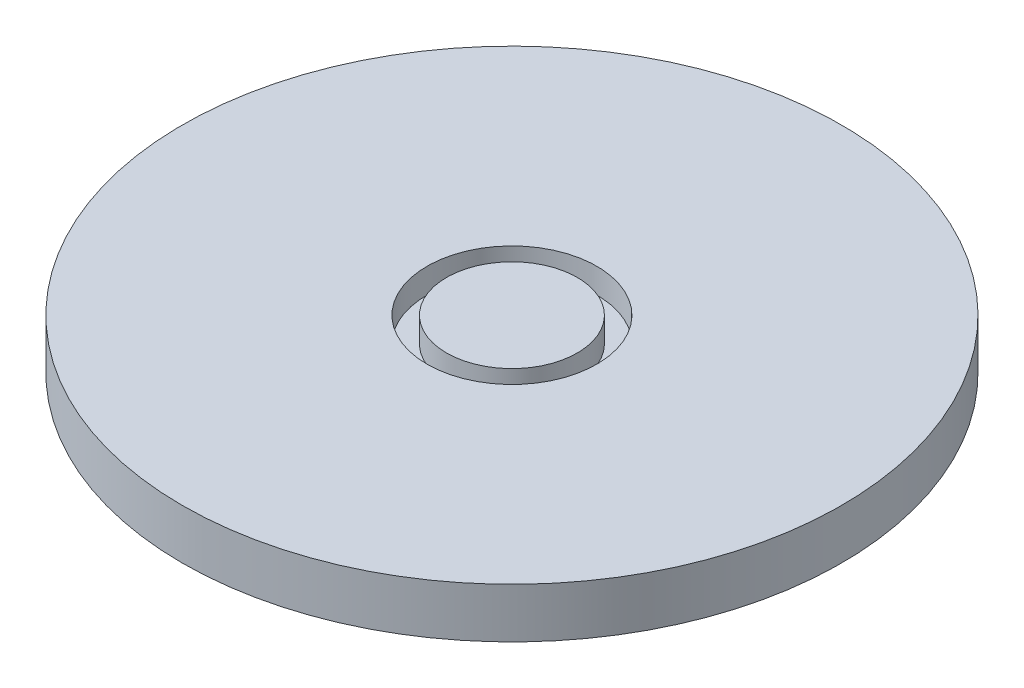
ISO-10303-21;
HEADER;
FILE_DESCRIPTION(('STEP AP214'),'2;1');
FILE_NAME('part.step','',(''),(''),'','','');
FILE_SCHEMA(('AUTOMOTIVE_DESIGN { 1 0 10303 214 1 1 1 1 }'));
ENDSEC;
DATA;
#1=APPLICATION_CONTEXT('core data for automotive mechanical design processes');
#2=APPLICATION_PROTOCOL_DEFINITION('international standard','automotive_design',2000,#1);
#3=PRODUCT_CONTEXT('',#1,'mechanical');
#4=PRODUCT('Part','Part','',(#3));
#5=PRODUCT_RELATED_PRODUCT_CATEGORY('part','',(#4));
#6=PRODUCT_DEFINITION_FORMATION('','',#4);
#7=PRODUCT_DEFINITION_CONTEXT('part definition',#1,'design');
#8=PRODUCT_DEFINITION('design','',#6,#7);
#9=PRODUCT_DEFINITION_SHAPE('','',#8);
#10=(LENGTH_UNIT() NAMED_UNIT(*) SI_UNIT(.MILLI.,.METRE.));
#11=(NAMED_UNIT(*) PLANE_ANGLE_UNIT() SI_UNIT($,.RADIAN.));
#12=(NAMED_UNIT(*) SI_UNIT($,.STERADIAN.) SOLID_ANGLE_UNIT());
#13=UNCERTAINTY_MEASURE_WITH_UNIT(LENGTH_MEASURE(1.E-05),#10,'distance_accuracy_value','');
#14=(GEOMETRIC_REPRESENTATION_CONTEXT(3) GLOBAL_UNCERTAINTY_ASSIGNED_CONTEXT((#13)) GLOBAL_UNIT_ASSIGNED_CONTEXT((#10,
#11,#12)) REPRESENTATION_CONTEXT('',''));
#15=CARTESIAN_POINT('',(0.,0.,0.));
#16=DIRECTION('',(0.,0.,1.));
#17=DIRECTION('',(1.,0.,0.));
#18=AXIS2_PLACEMENT_3D('',#15,#16,#17);
#19=CARTESIAN_POINT('',(0.,-15.,0.));
#20=DIRECTION('',(0.,1.,0.));
#21=DIRECTION('',(0.,0.,1.));
#22=AXIS2_PLACEMENT_3D('',#19,#20,#21);
#23=CYLINDRICAL_SURFACE('',#22,6.55);
#24=CARTESIAN_POINT('',(0.,-5.,0.));
#25=DIRECTION('',(0.,1.,0.));
#26=DIRECTION('',(0.,0.,1.));
#27=AXIS2_PLACEMENT_3D('',#24,#25,#26);
#28=CIRCLE('',#27,6.55);
#29=CARTESIAN_POINT('',(0.,-5.,6.55));
#30=VERTEX_POINT('',#29);
#31=EDGE_CURVE('E478',#30,#30,#28,.T.);
#32=ORIENTED_EDGE('',*,*,#31,.F.);
#33=EDGE_LOOP('',(#32));
#34=FACE_BOUND('',#33,.T.);
#35=CARTESIAN_POINT('',(0.,-5.09,0.));
#36=DIRECTION('',(0.,1.,0.));
#37=DIRECTION('',(0.,0.,1.));
#38=AXIS2_PLACEMENT_3D('',#35,#36,#37);
#39=CIRCLE('',#38,6.55);
#40=CARTESIAN_POINT('',(5.21648475074723,-5.09,-3.96115978536863));
#41=VERTEX_POINT('',#40);
#42=CARTESIAN_POINT('',(3.96115978536861,-5.09,-5.21648475074724));
#43=VERTEX_POINT('',#42);
#44=EDGE_CURVE('E170',#41,#43,#39,.T.);
#45=ORIENTED_EDGE('',*,*,#44,.T.);
#46=DIRECTION('',(0.,-1.,0.));
#47=VECTOR('',#46,1.);
#48=CARTESIAN_POINT('',(3.96115978536861,-5.09,-5.21648475074724));
#49=LINE('',#48,#47);
#50=CARTESIAN_POINT('',(3.96115978536861,-8.1,-5.21648475074724));
#51=VERTEX_POINT('',#50);
#52=EDGE_CURVE('E167',#43,#51,#49,.T.);
#53=ORIENTED_EDGE('',*,*,#52,.T.);
#54=CARTESIAN_POINT('',(0.,-8.1,0.));
#55=DIRECTION('',(0.,1.,0.));
#56=DIRECTION('',(0.,0.,1.));
#57=AXIS2_PLACEMENT_3D('',#54,#55,#56);
#58=CIRCLE('',#57,6.55);
#59=CARTESIAN_POINT('',(0.900943942071032,-8.1,-6.48774228936735));
#60=VERTEX_POINT('',#59);
#61=EDGE_CURVE('E398',#60,#51,#58,.F.);
#62=ORIENTED_EDGE('',*,*,#61,.F.);
#63=DIRECTION('',(0.,-1.,0.));
#64=VECTOR('',#63,1.);
#65=CARTESIAN_POINT('',(0.900943942071032,-5.09,-6.48774228936735));
#66=LINE('',#65,#64);
#67=CARTESIAN_POINT('',(0.900943942071032,-5.09,-6.48774228936735));
#68=VERTEX_POINT('',#67);
#69=EDGE_CURVE('E450',#68,#60,#66,.T.);
#70=ORIENTED_EDGE('',*,*,#69,.F.);
#71=CARTESIAN_POINT('',(0.,-5.09,0.));
#72=DIRECTION('',(0.,1.,0.));
#73=DIRECTION('',(0.,0.,1.));
#74=AXIS2_PLACEMENT_3D('',#71,#72,#73);
#75=CIRCLE('',#74,6.55);
#76=CARTESIAN_POINT('',(-0.911324658667031,-5.09,-6.48629226650368));
#77=VERTEX_POINT('',#76);
#78=EDGE_CURVE('E303',#68,#77,#75,.T.);
#79=ORIENTED_EDGE('',*,*,#78,.T.);
#80=DIRECTION('',(0.,-1.,0.));
#81=VECTOR('',#80,1.);
#82=CARTESIAN_POINT('',(-0.911324658667031,-5.09,-6.48629226650368));
#83=LINE('',#82,#81);
#84=CARTESIAN_POINT('',(-0.911324658667031,-8.1,-6.48629226650368));
#85=VERTEX_POINT('',#84);
#86=EDGE_CURVE('E309',#77,#85,#83,.T.);
#87=ORIENTED_EDGE('',*,*,#86,.T.);
#88=CARTESIAN_POINT('',(-3.95046299649503,-8.1,-5.22459013830975));
#89=VERTEX_POINT('',#88);
#90=EDGE_CURVE('E396',#89,#85,#58,.F.);
#91=ORIENTED_EDGE('',*,*,#90,.F.);
#92=DIRECTION('',(0.,-1.,0.));
#93=VECTOR('',#92,1.);
#94=CARTESIAN_POINT('',(-3.95046299649503,-5.09,-5.22459013830975));
#95=LINE('',#94,#93);
#96=CARTESIAN_POINT('',(-3.95046299649503,-5.09,-5.22459013830975));
#97=VERTEX_POINT('',#96);
#98=EDGE_CURVE('E300',#97,#89,#95,.T.);
#99=ORIENTED_EDGE('',*,*,#98,.F.);
#100=CARTESIAN_POINT('',(0.,-5.09,0.));
#101=DIRECTION('',(0.,1.,0.));
#102=DIRECTION('',(0.,0.,1.));
#103=AXIS2_PLACEMENT_3D('',#100,#101,#102);
#104=CIRCLE('',#103,6.55);
#105=CARTESIAN_POINT('',(-5.23090509240859,-5.09,-3.94209740039663));
#106=VERTEX_POINT('',#105);
#107=EDGE_CURVE('E292',#97,#106,#104,.T.);
#108=ORIENTED_EDGE('',*,*,#107,.T.);
#109=DIRECTION('',(0.,-1.,0.));
#110=VECTOR('',#109,1.);
#111=CARTESIAN_POINT('',(-5.23090509240859,-5.09,-3.94209740039663));
#112=LINE('',#111,#110);
#113=CARTESIAN_POINT('',(-5.23090509240859,-8.1,-3.94209740039663));
#114=VERTEX_POINT('',#113);
#115=EDGE_CURVE('E291',#106,#114,#112,.T.);
#116=ORIENTED_EDGE('',*,*,#115,.T.);
#117=CARTESIAN_POINT('',(-6.48957468680719,-8.1,-0.887648795611986));
#118=VERTEX_POINT('',#117);
#119=EDGE_CURVE('E407',#118,#114,#58,.F.);
#120=ORIENTED_EDGE('',*,*,#119,.F.);
#121=DIRECTION('',(0.,-1.,0.));
#122=VECTOR('',#121,1.);
#123=CARTESIAN_POINT('',(-6.48957468680719,-5.09,-0.887648795611986));
#124=LINE('',#123,#122);
#125=CARTESIAN_POINT('',(-6.48957468680719,-5.09,-0.887648795611986));
#126=VERTEX_POINT('',#125);
#127=EDGE_CURVE('E297',#126,#118,#124,.T.);
#128=ORIENTED_EDGE('',*,*,#127,.F.);
#129=CARTESIAN_POINT('',(0.,-5.09,0.));
#130=DIRECTION('',(0.,1.,0.));
#131=DIRECTION('',(0.,0.,1.));
#132=AXIS2_PLACEMENT_3D('',#129,#130,#131);
#133=CIRCLE('',#132,6.55);
#134=CARTESIAN_POINT('',(-6.48957468680719,-5.09,0.887648795611986));
#135=VERTEX_POINT('',#134);
#136=EDGE_CURVE('E264',#126,#135,#133,.T.);
#137=ORIENTED_EDGE('',*,*,#136,.T.);
#138=DIRECTION('',(0.,-1.,0.));
#139=VECTOR('',#138,1.);
#140=CARTESIAN_POINT('',(-6.48957468680719,-5.09,0.887648795611986));
#141=LINE('',#140,#139);
#142=CARTESIAN_POINT('',(-6.48957468680719,-8.1,0.887648795611986));
#143=VERTEX_POINT('',#142);
#144=EDGE_CURVE('E270',#135,#143,#141,.T.);
#145=ORIENTED_EDGE('',*,*,#144,.T.);
#146=CARTESIAN_POINT('',(-5.21648475074723,-8.1,3.96115978536863));
#147=VERTEX_POINT('',#146);
#148=EDGE_CURVE('E411',#147,#143,#58,.F.);
#149=ORIENTED_EDGE('',*,*,#148,.F.);
#150=DIRECTION('',(0.,-1.,0.));
#151=VECTOR('',#150,1.);
#152=CARTESIAN_POINT('',(-5.21648475074723,-5.09,3.96115978536863));
#153=LINE('',#152,#151);
#154=CARTESIAN_POINT('',(-5.21648475074723,-5.09,3.96115978536863));
#155=VERTEX_POINT('',#154);
#156=EDGE_CURVE('E261',#155,#147,#153,.T.);
#157=ORIENTED_EDGE('',*,*,#156,.F.);
#158=CARTESIAN_POINT('',(0.,-5.09,0.));
#159=DIRECTION('',(0.,1.,0.));
#160=DIRECTION('',(0.,0.,1.));
#161=AXIS2_PLACEMENT_3D('',#158,#159,#160);
#162=CIRCLE('',#161,6.55);
#163=CARTESIAN_POINT('',(-3.96115978536861,-5.09,5.21648475074724));
#164=VERTEX_POINT('',#163);
#165=EDGE_CURVE('E253',#155,#164,#162,.T.);
#166=ORIENTED_EDGE('',*,*,#165,.T.);
#167=DIRECTION('',(0.,-1.,0.));
#168=VECTOR('',#167,1.);
#169=CARTESIAN_POINT('',(-3.96115978536861,-5.09,5.21648475074724));
#170=LINE('',#169,#168);
#171=CARTESIAN_POINT('',(-3.96115978536861,-8.1,5.21648475074724));
#172=VERTEX_POINT('',#171);
#173=EDGE_CURVE('E252',#164,#172,#170,.T.);
#174=ORIENTED_EDGE('',*,*,#173,.T.);
#175=CARTESIAN_POINT('',(-0.873777917947728,-8.1,6.4914568588343));
#176=VERTEX_POINT('',#175);
#177=EDGE_CURVE('E414',#176,#172,#58,.F.);
#178=ORIENTED_EDGE('',*,*,#177,.F.);
#179=DIRECTION('',(0.,-1.,0.));
#180=VECTOR('',#179,1.);
#181=CARTESIAN_POINT('',(-0.873777917947728,-5.09,6.4914568588343));
#182=LINE('',#181,#180);
#183=CARTESIAN_POINT('',(-0.873777917947728,-5.09,6.4914568588343));
#184=VERTEX_POINT('',#183);
#185=EDGE_CURVE('E258',#184,#176,#182,.T.);
#186=ORIENTED_EDGE('',*,*,#185,.F.);
#187=CARTESIAN_POINT('',(0.,-5.09,0.));
#188=DIRECTION('',(0.,1.,0.));
#189=DIRECTION('',(0.,0.,1.));
#190=AXIS2_PLACEMENT_3D('',#187,#188,#189);
#191=CIRCLE('',#190,6.55);
#192=CARTESIAN_POINT('',(0.863388984897551,-5.09,6.49284679172068));
#193=VERTEX_POINT('',#192);
#194=EDGE_CURVE('E225',#184,#193,#191,.T.);
#195=ORIENTED_EDGE('',*,*,#194,.T.);
#196=DIRECTION('',(0.,-1.,0.));
#197=VECTOR('',#196,1.);
#198=CARTESIAN_POINT('',(0.863388984897551,-5.09,6.49284679172068));
#199=LINE('',#198,#197);
#200=CARTESIAN_POINT('',(0.863388984897551,-8.1,6.49284679172068));
#201=VERTEX_POINT('',#200);
#202=EDGE_CURVE('E231',#193,#201,#199,.T.);
#203=ORIENTED_EDGE('',*,*,#202,.T.);
#204=CARTESIAN_POINT('',(3.97229887362977,-8.1,5.20800745569356));
#205=VERTEX_POINT('',#204);
#206=EDGE_CURVE('E418',#205,#201,#58,.F.);
#207=ORIENTED_EDGE('',*,*,#206,.F.);
#208=DIRECTION('',(0.,-1.,0.));
#209=VECTOR('',#208,1.);
#210=CARTESIAN_POINT('',(3.97229887362977,-5.09,5.20800745569356));
#211=LINE('',#210,#209);
#212=CARTESIAN_POINT('',(3.97229887362977,-5.09,5.20800745569356));
#213=VERTEX_POINT('',#212);
#214=EDGE_CURVE('E222',#213,#205,#211,.T.);
#215=ORIENTED_EDGE('',*,*,#214,.F.);
#216=CARTESIAN_POINT('',(0.,-5.09,0.));
#217=DIRECTION('',(0.,1.,0.));
#218=DIRECTION('',(0.,0.,1.));
#219=AXIS2_PLACEMENT_3D('',#216,#217,#218);
#220=CIRCLE('',#219,6.55);
#221=CARTESIAN_POINT('',(5.20164420165385,-5.09,3.98062778960818));
#222=VERTEX_POINT('',#221);
#223=EDGE_CURVE('E215',#213,#222,#220,.T.);
#224=ORIENTED_EDGE('',*,*,#223,.T.);
#225=DIRECTION('',(0.,-1.,0.));
#226=VECTOR('',#225,1.);
#227=CARTESIAN_POINT('',(5.20164420165385,-5.09,3.98062778960818));
#228=LINE('',#227,#226);
#229=CARTESIAN_POINT('',(5.20164420165385,-8.1,3.98062778960818));
#230=VERTEX_POINT('',#229);
#231=EDGE_CURVE('E214',#222,#230,#228,.T.);
#232=ORIENTED_EDGE('',*,*,#231,.T.);
#233=CARTESIAN_POINT('',(6.48957468680719,-8.1,0.887648795611984));
#234=VERTEX_POINT('',#233);
#235=EDGE_CURVE('E404',#234,#230,#58,.F.);
#236=ORIENTED_EDGE('',*,*,#235,.F.);
#237=DIRECTION('',(0.,-1.,0.));
#238=VECTOR('',#237,1.);
#239=CARTESIAN_POINT('',(6.48957468680719,-5.09,0.887648795611984));
#240=LINE('',#239,#238);
#241=CARTESIAN_POINT('',(6.48957468680719,-5.09,0.887648795611984));
#242=VERTEX_POINT('',#241);
#243=EDGE_CURVE('E62',#242,#234,#240,.T.);
#244=ORIENTED_EDGE('',*,*,#243,.F.);
#245=CARTESIAN_POINT('',(0.,-5.09,0.));
#246=DIRECTION('',(0.,1.,0.));
#247=DIRECTION('',(0.,0.,1.));
#248=AXIS2_PLACEMENT_3D('',#245,#246,#247);
#249=CIRCLE('',#248,6.55);
#250=CARTESIAN_POINT('',(6.48957468680719,-5.09,-0.887648795611984));
#251=VERTEX_POINT('',#250);
#252=EDGE_CURVE('E181',#242,#251,#249,.T.);
#253=ORIENTED_EDGE('',*,*,#252,.T.);
#254=DIRECTION('',(0.,-1.,0.));
#255=VECTOR('',#254,1.);
#256=CARTESIAN_POINT('',(6.48957468680719,-5.09,-0.887648795611984));
#257=LINE('',#256,#255);
#258=CARTESIAN_POINT('',(6.48957468680719,-8.1,-0.887648795611984));
#259=VERTEX_POINT('',#258);
#260=EDGE_CURVE('E190',#251,#259,#257,.T.);
#261=ORIENTED_EDGE('',*,*,#260,.T.);
#262=CARTESIAN_POINT('',(5.21648475074723,-8.1,-3.96115978536863));
#263=VERTEX_POINT('',#262);
#264=EDGE_CURVE('E178',#263,#259,#58,.F.);
#265=ORIENTED_EDGE('',*,*,#264,.F.);
#266=DIRECTION('',(0.,-1.,0.));
#267=VECTOR('',#266,1.);
#268=CARTESIAN_POINT('',(5.21648475074723,-5.09,-3.96115978536863));
#269=LINE('',#268,#267);
#270=EDGE_CURVE('E54',#41,#263,#269,.T.);
#271=ORIENTED_EDGE('',*,*,#270,.F.);
#272=EDGE_LOOP('',(#45,#53,#62,#70,#79,#87,#91,#99,#108,#116,#120,#128,#137,#145,#149,#157,#166,
#174,#178,#186,#195,#203,#207,#215,#224,#232,#236,#244,#253,#261,#265,#271));
#273=FACE_BOUND('',#272,.T.);
#274=ADVANCED_FACE('F39',(#34,#273),#23,.T.);
#275=CARTESIAN_POINT('',(0.,-2.5,0.));
#276=DIRECTION('',(0.,1.,0.));
#277=DIRECTION('',(0.,0.,1.));
#278=AXIS2_PLACEMENT_3D('',#275,#276,#277);
#279=CYLINDRICAL_SURFACE('',#278,8.5);
#280=CARTESIAN_POINT('',(0.,0.,0.));
#281=DIRECTION('',(0.,1.,0.));
#282=DIRECTION('',(0.,0.,1.));
#283=AXIS2_PLACEMENT_3D('',#280,#281,#282);
#284=CIRCLE('',#283,8.5);
#285=CARTESIAN_POINT('',(0.,0.,8.5));
#286=VERTEX_POINT('',#285);
#287=EDGE_CURVE('E380',#286,#286,#284,.T.);
#288=ORIENTED_EDGE('',*,*,#287,.F.);
#289=EDGE_LOOP('',(#288));
#290=FACE_BOUND('',#289,.T.);
#291=CARTESIAN_POINT('',(0.,2.5,0.));
#292=DIRECTION('',(0.,1.,0.));
#293=DIRECTION('',(0.,0.,1.));
#294=AXIS2_PLACEMENT_3D('',#291,#292,#293);
#295=CIRCLE('',#294,8.5);
#296=CARTESIAN_POINT('',(0.,2.5,8.5));
#297=VERTEX_POINT('',#296);
#298=EDGE_CURVE('E383',#297,#297,#295,.T.);
#299=ORIENTED_EDGE('',*,*,#298,.T.);
#300=EDGE_LOOP('',(#299));
#301=FACE_BOUND('',#300,.T.);
#302=ADVANCED_FACE('F369',(#290,#301),#279,.F.);
#303=CARTESIAN_POINT('',(0.,-2.5,0.));
#304=DIRECTION('',(0.,1.,0.));
#305=DIRECTION('',(0.,0.,1.));
#306=AXIS2_PLACEMENT_3D('',#303,#304,#305);
#307=CYLINDRICAL_SURFACE('',#306,33.);
#308=CARTESIAN_POINT('',(0.,-2.5,0.));
#309=DIRECTION('',(0.,1.,0.));
#310=DIRECTION('',(0.,0.,1.));
#311=AXIS2_PLACEMENT_3D('',#308,#309,#310);
#312=CIRCLE('',#311,33.);
#313=CARTESIAN_POINT('',(0.,-2.5,33.));
#314=VERTEX_POINT('',#313);
#315=EDGE_CURVE('E388',#314,#314,#312,.T.);
#316=ORIENTED_EDGE('',*,*,#315,.T.);
#317=EDGE_LOOP('',(#316));
#318=FACE_BOUND('',#317,.T.);
#319=CARTESIAN_POINT('',(0.,2.5,0.));
#320=DIRECTION('',(0.,1.,0.));
#321=DIRECTION('',(0.,0.,1.));
#322=AXIS2_PLACEMENT_3D('',#319,#320,#321);
#323=CIRCLE('',#322,33.);
#324=CARTESIAN_POINT('',(0.,2.5,33.));
#325=VERTEX_POINT('',#324);
#326=EDGE_CURVE('E384',#325,#325,#323,.T.);
#327=ORIENTED_EDGE('',*,*,#326,.F.);
#328=EDGE_LOOP('',(#327));
#329=FACE_BOUND('',#328,.T.);
#330=ADVANCED_FACE('F366',(#318,#329),#307,.T.);
#331=CARTESIAN_POINT('',(0.,-2.5,0.));
#332=DIRECTION('',(0.,1.,0.));
#333=DIRECTION('',(0.,0.,1.));
#334=AXIS2_PLACEMENT_3D('',#331,#332,#333);
#335=PLANE('',#334);
#336=CARTESIAN_POINT('',(0.,-2.5,0.));
#337=DIRECTION('',(0.,1.,0.));
#338=DIRECTION('',(0.,0.,1.));
#339=AXIS2_PLACEMENT_3D('',#336,#337,#338);
#340=CIRCLE('',#339,10.5);
#341=CARTESIAN_POINT('',(0.,-2.5,10.5));
#342=VERTEX_POINT('',#341);
#343=EDGE_CURVE('E47',#342,#342,#340,.T.);
#344=ORIENTED_EDGE('',*,*,#343,.T.);
#345=EDGE_LOOP('',(#344));
#346=FACE_BOUND('',#345,.T.);
#347=ORIENTED_EDGE('',*,*,#315,.F.);
#348=EDGE_LOOP('',(#347));
#349=FACE_BOUND('',#348,.T.);
#350=ADVANCED_FACE('F362',(#346,#349),#335,.F.);
#351=CARTESIAN_POINT('',(0.,2.5,0.));
#352=DIRECTION('',(0.,1.,0.));
#353=DIRECTION('',(0.,0.,1.));
#354=AXIS2_PLACEMENT_3D('',#351,#352,#353);
#355=PLANE('',#354);
#356=ORIENTED_EDGE('',*,*,#298,.F.);
#357=EDGE_LOOP('',(#356));
#358=FACE_BOUND('',#357,.T.);
#359=ORIENTED_EDGE('',*,*,#326,.T.);
#360=EDGE_LOOP('',(#359));
#361=FACE_BOUND('',#360,.T.);
#362=ADVANCED_FACE('F358',(#358,#361),#355,.T.);
#363=CARTESIAN_POINT('',(0.,-5.,0.));
#364=DIRECTION('',(0.,1.,0.));
#365=DIRECTION('',(0.,0.,1.));
#366=AXIS2_PLACEMENT_3D('',#363,#364,#365);
#367=CYLINDRICAL_SURFACE('',#366,8.5);
#368=CARTESIAN_POINT('',(0.,-4.5,0.));
#369=DIRECTION('',(0.,1.,0.));
#370=DIRECTION('',(0.,0.,1.));
#371=AXIS2_PLACEMENT_3D('',#368,#369,#370);
#372=CIRCLE('',#371,8.5);
#373=CARTESIAN_POINT('',(0.,-4.5,8.5));
#374=VERTEX_POINT('',#373);
#375=EDGE_CURVE('E11',#374,#374,#372,.F.);
#376=ORIENTED_EDGE('',*,*,#375,.T.);
#377=EDGE_LOOP('',(#376));
#378=FACE_BOUND('',#377,.T.);
#379=CARTESIAN_POINT('',(0.,-5.,0.));
#380=DIRECTION('',(0.,1.,0.));
#381=DIRECTION('',(0.,0.,1.));
#382=AXIS2_PLACEMENT_3D('',#379,#380,#381);
#383=CIRCLE('',#382,8.5);
#384=CARTESIAN_POINT('',(0.,-5.,8.5));
#385=VERTEX_POINT('',#384);
#386=EDGE_CURVE('E385',#385,#385,#383,.T.);
#387=ORIENTED_EDGE('',*,*,#386,.T.);
#388=EDGE_LOOP('',(#387));
#389=FACE_BOUND('',#388,.T.);
#390=ADVANCED_FACE('F351',(#378,#389),#367,.T.);
#391=CARTESIAN_POINT('',(0.,-5.,0.));
#392=DIRECTION('',(0.,1.,0.));
#393=DIRECTION('',(0.,0.,1.));
#394=AXIS2_PLACEMENT_3D('',#391,#392,#393);
#395=PLANE('',#394);
#396=ORIENTED_EDGE('',*,*,#31,.T.);
#397=EDGE_LOOP('',(#396));
#398=FACE_BOUND('',#397,.T.);
#399=ORIENTED_EDGE('',*,*,#386,.F.);
#400=EDGE_LOOP('',(#399));
#401=FACE_BOUND('',#400,.T.);
#402=ADVANCED_FACE('F348',(#398,#401),#395,.F.);
#403=CARTESIAN_POINT('',(0.,0.,0.));
#404=DIRECTION('',(0.,1.,0.));
#405=DIRECTION('',(0.,0.,1.));
#406=AXIS2_PLACEMENT_3D('',#403,#404,#405);
#407=PLANE('',#406);
#408=CARTESIAN_POINT('',(0.,0.,0.));
#409=DIRECTION('',(0.,1.,0.));
#410=DIRECTION('',(0.,0.,1.));
#411=AXIS2_PLACEMENT_3D('',#408,#409,#410);
#412=CIRCLE('',#411,6.55);
#413=CARTESIAN_POINT('',(0.,0.,6.55));
#414=VERTEX_POINT('',#413);
#415=EDGE_CURVE('E480',#414,#414,#412,.T.);
#416=ORIENTED_EDGE('',*,*,#415,.F.);
#417=EDGE_LOOP('',(#416));
#418=FACE_BOUND('',#417,.T.);
#419=ORIENTED_EDGE('',*,*,#287,.T.);
#420=EDGE_LOOP('',(#419));
#421=FACE_BOUND('',#420,.T.);
#422=ADVANCED_FACE('F343',(#418,#421),#407,.T.);
#423=CARTESIAN_POINT('',(0.,2.5,0.));
#424=DIRECTION('',(0.,1.,0.));
#425=DIRECTION('',(0.,0.,1.));
#426=AXIS2_PLACEMENT_3D('',#423,#424,#425);
#427=PLANE('',#426);
#428=CARTESIAN_POINT('',(0.,2.5,0.));
#429=DIRECTION('',(0.,1.,0.));
#430=DIRECTION('',(0.,0.,1.));
#431=AXIS2_PLACEMENT_3D('',#428,#429,#430);
#432=CIRCLE('',#431,6.55);
#433=CARTESIAN_POINT('',(0.,2.5,6.55));
#434=VERTEX_POINT('',#433);
#435=EDGE_CURVE('E457',#434,#434,#432,.T.);
#436=ORIENTED_EDGE('',*,*,#435,.T.);
#437=EDGE_LOOP('',(#436));
#438=FACE_BOUND('',#437,.T.);
#439=ADVANCED_FACE('F332',(#438),#427,.T.);
#440=ORIENTED_EDGE('',*,*,#415,.T.);
#441=EDGE_LOOP('',(#440));
#442=FACE_BOUND('',#441,.T.);
#443=ORIENTED_EDGE('',*,*,#435,.F.);
#444=EDGE_LOOP('',(#443));
#445=FACE_BOUND('',#444,.T.);
#446=ADVANCED_FACE('F323',(#442,#445),#23,.T.);
#447=CARTESIAN_POINT('',(0.,-39.0416305603426,0.));
#448=DIRECTION('',(0.,1.,0.));
#449=DIRECTION('',(0.,0.,1.));
#450=AXIS2_PLACEMENT_3D('',#447,#448,#449);
#451=CYLINDRICAL_SURFACE('',#450,8.5);
#452=CARTESIAN_POINT('',(0.,-15.,0.));
#453=DIRECTION('',(0.,1.,0.));
#454=DIRECTION('',(0.,0.,1.));
#455=AXIS2_PLACEMENT_3D('',#452,#453,#454);
#456=CIRCLE('',#455,8.5);
#457=CARTESIAN_POINT('',(0.,-15.,8.5));
#458=VERTEX_POINT('',#457);
#459=EDGE_CURVE('E455',#458,#458,#456,.F.);
#460=ORIENTED_EDGE('',*,*,#459,.F.);
#461=EDGE_LOOP('',(#460));
#462=FACE_BOUND('',#461,.T.);
#463=CARTESIAN_POINT('',(0.,-8.1,0.));
#464=DIRECTION('',(0.,1.,0.));
#465=DIRECTION('',(0.,0.,1.));
#466=AXIS2_PLACEMENT_3D('',#463,#464,#465);
#467=CIRCLE('',#466,8.5);
#468=CARTESIAN_POINT('',(0.,-8.1,8.5));
#469=VERTEX_POINT('',#468);
#470=EDGE_CURVE('E451',#469,#469,#467,.T.);
#471=ORIENTED_EDGE('',*,*,#470,.F.);
#472=EDGE_LOOP('',(#471));
#473=FACE_BOUND('',#472,.T.);
#474=ADVANCED_FACE('F319',(#462,#473),#451,.T.);
#475=CARTESIAN_POINT('',(0.,-8.1,0.));
#476=DIRECTION('',(0.,1.,0.));
#477=DIRECTION('',(0.,0.,1.));
#478=AXIS2_PLACEMENT_3D('',#475,#476,#477);
#479=PLANE('',#478);
#480=ORIENTED_EDGE('',*,*,#61,.T.);
#481=CARTESIAN_POINT('',(0.,-8.1,0.));
#482=DIRECTION('',(0.,1.,0.));
#483=DIRECTION('',(0.707106781186546,0.,-0.707106781186549));
#484=AXIS2_PLACEMENT_3D('',#481,#482,#483);
#485=ELLIPSE('',#484,7.8,1.6);
#486=EDGE_CURVE('E174',#263,#51,#485,.T.);
#487=ORIENTED_EDGE('',*,*,#486,.F.);
#488=ORIENTED_EDGE('',*,*,#264,.T.);
#489=CARTESIAN_POINT('',(0.,-8.1,0.));
#490=DIRECTION('',(0.,1.,0.));
#491=DIRECTION('',(1.,0.,0.));
#492=AXIS2_PLACEMENT_3D('',#489,#490,#491);
#493=ELLIPSE('',#492,7.8,1.6);
#494=EDGE_CURVE('E179',#234,#259,#493,.T.);
#495=ORIENTED_EDGE('',*,*,#494,.F.);
#496=ORIENTED_EDGE('',*,*,#235,.T.);
#497=CARTESIAN_POINT('',(-0.0448443711852252,-8.1,-0.0378101743815135));
#498=DIRECTION('',(0.,1.,0.));
#499=DIRECTION('',(-0.707106781186551,0.,-0.707106781186544));
#500=AXIS2_PLACEMENT_3D('',#497,#498,#499);
#501=ELLIPSE('',#500,7.8,1.6);
#502=EDGE_CURVE('E217',#205,#230,#501,.T.);
#503=ORIENTED_EDGE('',*,*,#502,.F.);
#504=ORIENTED_EDGE('',*,*,#206,.T.);
#505=CARTESIAN_POINT('',(-0.0049739282601052,-8.1,-0.0584455896661335));
#506=DIRECTION('',(0.,1.,0.));
#507=DIRECTION('',(0.,0.,-1.));
#508=AXIS2_PLACEMENT_3D('',#505,#506,#507);
#509=ELLIPSE('',#508,7.8,1.6);
#510=EDGE_CURVE('E224',#176,#201,#509,.T.);
#511=ORIENTED_EDGE('',*,*,#510,.F.);
#512=ORIENTED_EDGE('',*,*,#177,.T.);
#513=CARTESIAN_POINT('',(0.,-8.1,0.));
#514=DIRECTION('',(0.,1.,0.));
#515=DIRECTION('',(0.707106781186546,0.,-0.707106781186549));
#516=AXIS2_PLACEMENT_3D('',#513,#514,#515);
#517=ELLIPSE('',#516,7.8,1.6);
#518=EDGE_CURVE('E255',#147,#172,#517,.T.);
#519=ORIENTED_EDGE('',*,*,#518,.F.);
#520=ORIENTED_EDGE('',*,*,#148,.T.);
#521=CARTESIAN_POINT('',(0.,-8.1,0.));
#522=DIRECTION('',(0.,1.,0.));
#523=DIRECTION('',(1.,0.,0.));
#524=AXIS2_PLACEMENT_3D('',#521,#522,#523);
#525=ELLIPSE('',#524,7.8,1.6);
#526=EDGE_CURVE('E263',#118,#143,#525,.T.);
#527=ORIENTED_EDGE('',*,*,#526,.F.);
#528=ORIENTED_EDGE('',*,*,#119,.T.);
#529=CARTESIAN_POINT('',(-0.0448443711852252,-8.1,-0.0378101743815135));
#530=DIRECTION('',(0.,1.,0.));
#531=DIRECTION('',(-0.707106781186551,0.,-0.707106781186544));
#532=AXIS2_PLACEMENT_3D('',#529,#530,#531);
#533=ELLIPSE('',#532,7.8,1.6);
#534=EDGE_CURVE('E294',#89,#114,#533,.T.);
#535=ORIENTED_EDGE('',*,*,#534,.F.);
#536=ORIENTED_EDGE('',*,*,#90,.T.);
#537=CARTESIAN_POINT('',(-0.0049739282601052,-8.1,-0.0584455896661335));
#538=DIRECTION('',(0.,1.,0.));
#539=DIRECTION('',(0.,0.,-1.));
#540=AXIS2_PLACEMENT_3D('',#537,#538,#539);
#541=ELLIPSE('',#540,7.8,1.6);
#542=EDGE_CURVE('E302',#60,#85,#541,.T.);
#543=ORIENTED_EDGE('',*,*,#542,.F.);
#544=EDGE_LOOP('',(#480,#487,#488,#495,#496,#503,#504,#511,#512,#519,#520,#527,#528,#535,#536,#543));
#545=FACE_BOUND('',#544,.T.);
#546=ORIENTED_EDGE('',*,*,#470,.T.);
#547=EDGE_LOOP('',(#546));
#548=FACE_BOUND('',#547,.T.);
#549=ADVANCED_FACE('F315',(#545,#548),#479,.T.);
#550=CARTESIAN_POINT('',(0.,0.,0.));
#551=DIRECTION('',(0.,1.,0.));
#552=DIRECTION('',(0.,0.,1.));
#553=AXIS2_PLACEMENT_3D('',#550,#551,#552);
#554=PLANE('',#553);
#555=DIRECTION('',(1.,0.,0.));
#556=VECTOR('',#555,1.);
#557=CARTESIAN_POINT('',(0.,0.,-2.04));
#558=LINE('',#557,#556);
#559=CARTESIAN_POINT('',(-1.53,0.,-2.04));
#560=VERTEX_POINT('',#559);
#561=CARTESIAN_POINT('',(1.53,0.,-2.04));
#562=VERTEX_POINT('',#561);
#563=EDGE_CURVE('E471',#560,#562,#558,.T.);
#564=ORIENTED_EDGE('',*,*,#563,.T.);
#565=CARTESIAN_POINT('',(0.,0.,0.));
#566=DIRECTION('',(0.,1.,0.));
#567=DIRECTION('',(0.,0.,1.));
#568=AXIS2_PLACEMENT_3D('',#565,#566,#567);
#569=CIRCLE('',#568,2.55);
#570=EDGE_CURVE('E475',#560,#562,#569,.T.);
#571=ORIENTED_EDGE('',*,*,#570,.F.);
#572=EDGE_LOOP('',(#564,#571));
#573=FACE_BOUND('',#572,.T.);
#574=ADVANCED_FACE('F318',(#573),#554,.F.);
#575=CARTESIAN_POINT('',(0.,-15.,-2.04));
#576=DIRECTION('',(0.,0.,1.));
#577=DIRECTION('',(1.,0.,0.));
#578=AXIS2_PLACEMENT_3D('',#575,#576,#577);
#579=PLANE('',#578);
#580=ORIENTED_EDGE('',*,*,#563,.F.);
#581=DIRECTION('',(0.,1.,0.));
#582=VECTOR('',#581,1.);
#583=CARTESIAN_POINT('',(-1.53,-15.,-2.04));
#584=LINE('',#583,#582);
#585=CARTESIAN_POINT('',(-1.53,-15.,-2.04));
#586=VERTEX_POINT('',#585);
#587=EDGE_CURVE('E469',#586,#560,#584,.T.);
#588=ORIENTED_EDGE('',*,*,#587,.F.);
#589=DIRECTION('',(1.,0.,0.));
#590=VECTOR('',#589,1.);
#591=CARTESIAN_POINT('',(0.,-15.,-2.04));
#592=LINE('',#591,#590);
#593=CARTESIAN_POINT('',(1.53,-15.,-2.04));
#594=VERTEX_POINT('',#593);
#595=EDGE_CURVE('E461',#586,#594,#592,.T.);
#596=ORIENTED_EDGE('',*,*,#595,.T.);
#597=DIRECTION('',(0.,1.,0.));
#598=VECTOR('',#597,1.);
#599=CARTESIAN_POINT('',(1.53,-15.,-2.04));
#600=LINE('',#599,#598);
#601=EDGE_CURVE('E468',#594,#562,#600,.T.);
#602=ORIENTED_EDGE('',*,*,#601,.T.);
#603=EDGE_LOOP('',(#580,#588,#596,#602));
#604=FACE_BOUND('',#603,.T.);
#605=ADVANCED_FACE('F336',(#604),#579,.T.);
#606=CARTESIAN_POINT('',(0.,-15.,0.));
#607=DIRECTION('',(0.,1.,0.));
#608=DIRECTION('',(0.,0.,1.));
#609=AXIS2_PLACEMENT_3D('',#606,#607,#608);
#610=CYLINDRICAL_SURFACE('',#609,2.55);
#611=ORIENTED_EDGE('',*,*,#570,.T.);
#612=ORIENTED_EDGE('',*,*,#601,.F.);
#613=CARTESIAN_POINT('',(0.,-15.,0.));
#614=DIRECTION('',(0.,1.,0.));
#615=DIRECTION('',(0.,0.,1.));
#616=AXIS2_PLACEMENT_3D('',#613,#614,#615);
#617=CIRCLE('',#616,2.55);
#618=EDGE_CURVE('E464',#586,#594,#617,.T.);
#619=ORIENTED_EDGE('',*,*,#618,.F.);
#620=ORIENTED_EDGE('',*,*,#587,.T.);
#621=EDGE_LOOP('',(#611,#612,#619,#620));
#622=FACE_BOUND('',#621,.T.);
#623=ADVANCED_FACE('F328',(#622),#610,.F.);
#624=CARTESIAN_POINT('',(0.,-15.,0.));
#625=DIRECTION('',(0.,1.,0.));
#626=DIRECTION('',(0.,0.,1.));
#627=AXIS2_PLACEMENT_3D('',#624,#625,#626);
#628=PLANE('',#627);
#629=ORIENTED_EDGE('',*,*,#618,.T.);
#630=ORIENTED_EDGE('',*,*,#595,.F.);
#631=EDGE_LOOP('',(#629,#630));
#632=FACE_BOUND('',#631,.T.);
#633=ORIENTED_EDGE('',*,*,#459,.T.);
#634=EDGE_LOOP('',(#633));
#635=FACE_BOUND('',#634,.T.);
#636=ADVANCED_FACE('F325',(#632,#635),#628,.F.);
#637=CARTESIAN_POINT('',(0.,-4.5,0.));
#638=DIRECTION('',(0.,1.,0.));
#639=DIRECTION('',(0.,0.,1.));
#640=AXIS2_PLACEMENT_3D('',#637,#638,#639);
#641=TOROIDAL_SURFACE('',#640,10.5,2.);
#642=ORIENTED_EDGE('',*,*,#375,.F.);
#643=EDGE_LOOP('',(#642));
#644=FACE_BOUND('',#643,.T.);
#645=ORIENTED_EDGE('',*,*,#343,.F.);
#646=EDGE_LOOP('',(#645));
#647=FACE_BOUND('',#646,.T.);
#648=ADVANCED_FACE('F41',(#644,#647),#641,.F.);
#649=CARTESIAN_POINT('',(-0.0049739282601052,-5.09,-0.0584455896661335));
#650=DIRECTION('',(0.,1.,0.));
#651=DIRECTION('',(0.,0.,-1.));
#652=AXIS2_PLACEMENT_3D('',#649,#650,#651);
#653=ELLIPSE('',#652,7.8,1.6);
#654=DIRECTION('',(0.,-1.,0.));
#655=VECTOR('',#654,1.);
#656=SURFACE_OF_LINEAR_EXTRUSION('',#653,#655);
#657=ORIENTED_EDGE('',*,*,#542,.T.);
#658=ORIENTED_EDGE('',*,*,#86,.F.);
#659=EDGE_CURVE('E306',#68,#77,#653,.T.);
#660=ORIENTED_EDGE('',*,*,#659,.F.);
#661=ORIENTED_EDGE('',*,*,#69,.T.);
#662=EDGE_LOOP('',(#657,#658,#660,#661));
#663=FACE_BOUND('',#662,.T.);
#664=ADVANCED_FACE('F311',(#663),#656,.F.);
#665=CARTESIAN_POINT('',(0.,-5.09,0.));
#666=DIRECTION('',(0.,1.,0.));
#667=DIRECTION('',(0.,0.,1.));
#668=AXIS2_PLACEMENT_3D('',#665,#666,#667);
#669=PLANE('',#668);
#670=ORIENTED_EDGE('',*,*,#78,.F.);
#671=ORIENTED_EDGE('',*,*,#659,.T.);
#672=EDGE_LOOP('',(#670,#671));
#673=FACE_BOUND('',#672,.T.);
#674=ADVANCED_FACE('F284',(#673),#669,.T.);
#675=CARTESIAN_POINT('',(-0.0448443711852252,-5.09,-0.0378101743815135));
#676=DIRECTION('',(0.,1.,0.));
#677=DIRECTION('',(-0.707106781186551,0.,-0.707106781186544));
#678=AXIS2_PLACEMENT_3D('',#675,#676,#677);
#679=ELLIPSE('',#678,7.8,1.6);
#680=DIRECTION('',(0.,-1.,0.));
#681=VECTOR('',#680,1.);
#682=SURFACE_OF_LINEAR_EXTRUSION('',#679,#681);
#683=ORIENTED_EDGE('',*,*,#534,.T.);
#684=ORIENTED_EDGE('',*,*,#115,.F.);
#685=EDGE_CURVE('E287',#97,#106,#679,.T.);
#686=ORIENTED_EDGE('',*,*,#685,.F.);
#687=ORIENTED_EDGE('',*,*,#98,.T.);
#688=EDGE_LOOP('',(#683,#684,#686,#687));
#689=FACE_BOUND('',#688,.T.);
#690=ADVANCED_FACE('F279',(#689),#682,.F.);
#691=CARTESIAN_POINT('',(0.,-5.09,0.));
#692=DIRECTION('',(0.,1.,0.));
#693=DIRECTION('',(0.,0.,1.));
#694=AXIS2_PLACEMENT_3D('',#691,#692,#693);
#695=PLANE('',#694);
#696=ORIENTED_EDGE('',*,*,#107,.F.);
#697=ORIENTED_EDGE('',*,*,#685,.T.);
#698=EDGE_LOOP('',(#696,#697));
#699=FACE_BOUND('',#698,.T.);
#700=ADVANCED_FACE('F275',(#699),#695,.T.);
#701=CARTESIAN_POINT('',(0.,-5.09,0.));
#702=DIRECTION('',(0.,1.,0.));
#703=DIRECTION('',(1.,0.,0.));
#704=AXIS2_PLACEMENT_3D('',#701,#702,#703);
#705=ELLIPSE('',#704,7.8,1.6);
#706=DIRECTION('',(0.,-1.,0.));
#707=VECTOR('',#706,1.);
#708=SURFACE_OF_LINEAR_EXTRUSION('',#705,#707);
#709=ORIENTED_EDGE('',*,*,#526,.T.);
#710=ORIENTED_EDGE('',*,*,#144,.F.);
#711=EDGE_CURVE('E267',#126,#135,#705,.T.);
#712=ORIENTED_EDGE('',*,*,#711,.F.);
#713=ORIENTED_EDGE('',*,*,#127,.T.);
#714=EDGE_LOOP('',(#709,#710,#712,#713));
#715=FACE_BOUND('',#714,.T.);
#716=ADVANCED_FACE('F272',(#715),#708,.F.);
#717=CARTESIAN_POINT('',(0.,-5.09,0.));
#718=DIRECTION('',(0.,1.,0.));
#719=DIRECTION('',(0.,0.,1.));
#720=AXIS2_PLACEMENT_3D('',#717,#718,#719);
#721=PLANE('',#720);
#722=ORIENTED_EDGE('',*,*,#136,.F.);
#723=ORIENTED_EDGE('',*,*,#711,.T.);
#724=EDGE_LOOP('',(#722,#723));
#725=FACE_BOUND('',#724,.T.);
#726=ADVANCED_FACE('F245',(#725),#721,.T.);
#727=CARTESIAN_POINT('',(0.,-5.09,0.));
#728=DIRECTION('',(0.,1.,0.));
#729=DIRECTION('',(0.707106781186546,0.,-0.707106781186549));
#730=AXIS2_PLACEMENT_3D('',#727,#728,#729);
#731=ELLIPSE('',#730,7.8,1.6);
#732=DIRECTION('',(0.,-1.,0.));
#733=VECTOR('',#732,1.);
#734=SURFACE_OF_LINEAR_EXTRUSION('',#731,#733);
#735=ORIENTED_EDGE('',*,*,#518,.T.);
#736=ORIENTED_EDGE('',*,*,#173,.F.);
#737=EDGE_CURVE('E248',#155,#164,#731,.T.);
#738=ORIENTED_EDGE('',*,*,#737,.F.);
#739=ORIENTED_EDGE('',*,*,#156,.T.);
#740=EDGE_LOOP('',(#735,#736,#738,#739));
#741=FACE_BOUND('',#740,.T.);
#742=ADVANCED_FACE('F240',(#741),#734,.F.);
#743=CARTESIAN_POINT('',(0.,-5.09,0.));
#744=DIRECTION('',(0.,1.,0.));
#745=DIRECTION('',(0.,0.,1.));
#746=AXIS2_PLACEMENT_3D('',#743,#744,#745);
#747=PLANE('',#746);
#748=ORIENTED_EDGE('',*,*,#165,.F.);
#749=ORIENTED_EDGE('',*,*,#737,.T.);
#750=EDGE_LOOP('',(#748,#749));
#751=FACE_BOUND('',#750,.T.);
#752=ADVANCED_FACE('F236',(#751),#747,.T.);
#753=CARTESIAN_POINT('',(-0.0049739282601052,-5.09,-0.0584455896661335));
#754=DIRECTION('',(0.,1.,0.));
#755=DIRECTION('',(0.,0.,-1.));
#756=AXIS2_PLACEMENT_3D('',#753,#754,#755);
#757=ELLIPSE('',#756,7.8,1.6);
#758=DIRECTION('',(0.,-1.,0.));
#759=VECTOR('',#758,1.);
#760=SURFACE_OF_LINEAR_EXTRUSION('',#757,#759);
#761=ORIENTED_EDGE('',*,*,#510,.T.);
#762=ORIENTED_EDGE('',*,*,#202,.F.);
#763=EDGE_CURVE('E228',#184,#193,#757,.T.);
#764=ORIENTED_EDGE('',*,*,#763,.F.);
#765=ORIENTED_EDGE('',*,*,#185,.T.);
#766=EDGE_LOOP('',(#761,#762,#764,#765));
#767=FACE_BOUND('',#766,.T.);
#768=ADVANCED_FACE('F233',(#767),#760,.F.);
#769=CARTESIAN_POINT('',(0.,-5.09,0.));
#770=DIRECTION('',(0.,1.,0.));
#771=DIRECTION('',(0.,0.,1.));
#772=AXIS2_PLACEMENT_3D('',#769,#770,#771);
#773=PLANE('',#772);
#774=ORIENTED_EDGE('',*,*,#194,.F.);
#775=ORIENTED_EDGE('',*,*,#763,.T.);
#776=EDGE_LOOP('',(#774,#775));
#777=FACE_BOUND('',#776,.T.);
#778=ADVANCED_FACE('F207',(#777),#773,.T.);
#779=CARTESIAN_POINT('',(-0.0448443711852252,-5.09,-0.0378101743815135));
#780=DIRECTION('',(0.,1.,0.));
#781=DIRECTION('',(-0.707106781186551,0.,-0.707106781186544));
#782=AXIS2_PLACEMENT_3D('',#779,#780,#781);
#783=ELLIPSE('',#782,7.8,1.6);
#784=DIRECTION('',(0.,-1.,0.));
#785=VECTOR('',#784,1.);
#786=SURFACE_OF_LINEAR_EXTRUSION('',#783,#785);
#787=ORIENTED_EDGE('',*,*,#502,.T.);
#788=ORIENTED_EDGE('',*,*,#231,.F.);
#789=EDGE_CURVE('E210',#213,#222,#783,.T.);
#790=ORIENTED_EDGE('',*,*,#789,.F.);
#791=ORIENTED_EDGE('',*,*,#214,.T.);
#792=EDGE_LOOP('',(#787,#788,#790,#791));
#793=FACE_BOUND('',#792,.T.);
#794=ADVANCED_FACE('F202',(#793),#786,.F.);
#795=CARTESIAN_POINT('',(0.,-5.09,0.));
#796=DIRECTION('',(0.,1.,0.));
#797=DIRECTION('',(0.,0.,1.));
#798=AXIS2_PLACEMENT_3D('',#795,#796,#797);
#799=PLANE('',#798);
#800=ORIENTED_EDGE('',*,*,#223,.F.);
#801=ORIENTED_EDGE('',*,*,#789,.T.);
#802=EDGE_LOOP('',(#800,#801));
#803=FACE_BOUND('',#802,.T.);
#804=ADVANCED_FACE('F198',(#803),#799,.T.);
#805=CARTESIAN_POINT('',(0.,-5.09,0.));
#806=DIRECTION('',(0.,1.,0.));
#807=DIRECTION('',(1.,0.,0.));
#808=AXIS2_PLACEMENT_3D('',#805,#806,#807);
#809=ELLIPSE('',#808,7.8,1.6);
#810=DIRECTION('',(0.,-1.,0.));
#811=VECTOR('',#810,1.);
#812=SURFACE_OF_LINEAR_EXTRUSION('',#809,#811);
#813=ORIENTED_EDGE('',*,*,#494,.T.);
#814=ORIENTED_EDGE('',*,*,#260,.F.);
#815=EDGE_CURVE('E188',#242,#251,#809,.T.);
#816=ORIENTED_EDGE('',*,*,#815,.F.);
#817=ORIENTED_EDGE('',*,*,#243,.T.);
#818=EDGE_LOOP('',(#813,#814,#816,#817));
#819=FACE_BOUND('',#818,.T.);
#820=ADVANCED_FACE('F193',(#819),#812,.F.);
#821=CARTESIAN_POINT('',(0.,-5.09,0.));
#822=DIRECTION('',(0.,1.,0.));
#823=DIRECTION('',(0.,0.,1.));
#824=AXIS2_PLACEMENT_3D('',#821,#822,#823);
#825=PLANE('',#824);
#826=ORIENTED_EDGE('',*,*,#252,.F.);
#827=ORIENTED_EDGE('',*,*,#815,.T.);
#828=EDGE_LOOP('',(#826,#827));
#829=FACE_BOUND('',#828,.T.);
#830=ADVANCED_FACE('F197',(#829),#825,.T.);
#831=CARTESIAN_POINT('',(0.,-5.09,0.));
#832=DIRECTION('',(0.,1.,0.));
#833=DIRECTION('',(0.707106781186546,0.,-0.707106781186549));
#834=AXIS2_PLACEMENT_3D('',#831,#832,#833);
#835=ELLIPSE('',#834,7.8,1.6);
#836=DIRECTION('',(0.,-1.,0.));
#837=VECTOR('',#836,1.);
#838=SURFACE_OF_LINEAR_EXTRUSION('',#835,#837);
#839=ORIENTED_EDGE('',*,*,#486,.T.);
#840=ORIENTED_EDGE('',*,*,#52,.F.);
#841=EDGE_CURVE('E163',#41,#43,#835,.T.);
#842=ORIENTED_EDGE('',*,*,#841,.F.);
#843=ORIENTED_EDGE('',*,*,#270,.T.);
#844=EDGE_LOOP('',(#839,#840,#842,#843));
#845=FACE_BOUND('',#844,.T.);
#846=ADVANCED_FACE('F165',(#845),#838,.F.);
#847=CARTESIAN_POINT('',(0.,-5.09,0.));
#848=DIRECTION('',(0.,1.,0.));
#849=DIRECTION('',(0.,0.,1.));
#850=AXIS2_PLACEMENT_3D('',#847,#848,#849);
#851=PLANE('',#850);
#852=ORIENTED_EDGE('',*,*,#44,.F.);
#853=ORIENTED_EDGE('',*,*,#841,.T.);
#854=EDGE_LOOP('',(#852,#853));
#855=FACE_BOUND('',#854,.T.);
#856=ADVANCED_FACE('F172',(#855),#851,.T.);
#857=CLOSED_SHELL('',(#274,#302,#330,#350,#362,#390,#402,#422,#439,#446,#474,#549,#574,#605,
#623,#636,#648,#664,#674,#690,#700,#716,#726,#742,#752,#768,#778,#794,#804,#820,#830,#846,#856));
#858=MANIFOLD_SOLID_BREP('B2',#857);
#859=ADVANCED_BREP_SHAPE_REPRESENTATION('',(#18,#858),#14);
#860=SHAPE_DEFINITION_REPRESENTATION(#9,#859);
ENDSEC;
END-ISO-10303-21;
